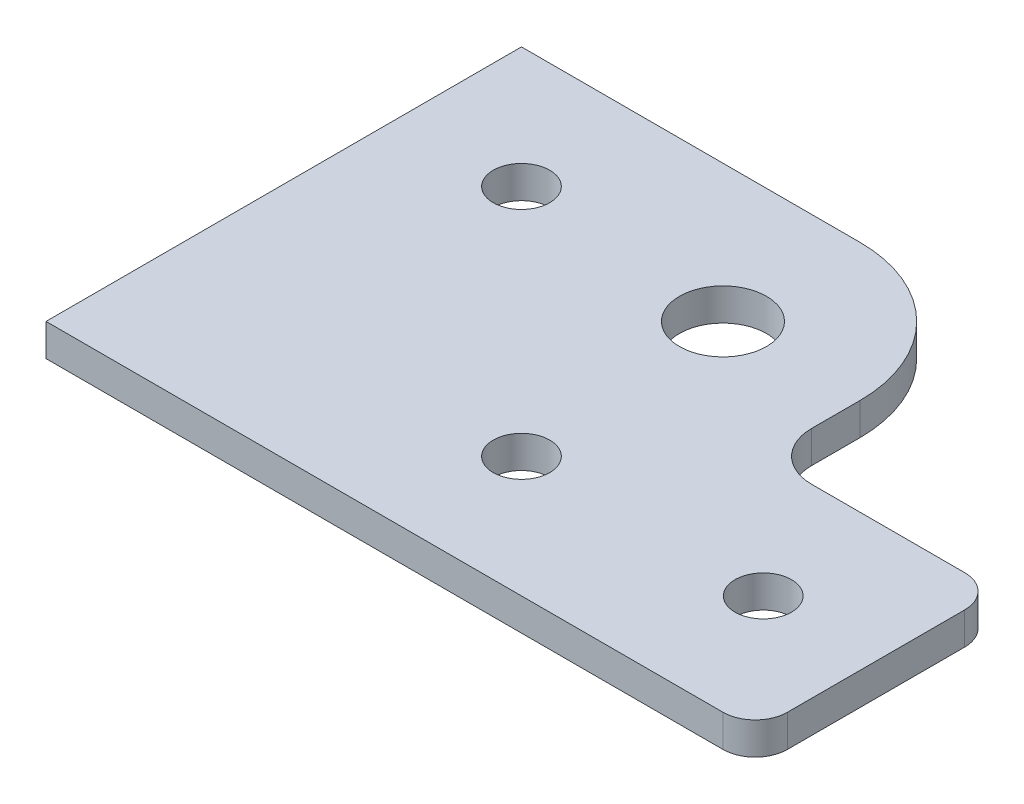
ISO-10303-21;
HEADER;
FILE_DESCRIPTION(('STEP AP214'),'2;1');
FILE_NAME('part.step','',(''),(''),'','','');
FILE_SCHEMA(('AUTOMOTIVE_DESIGN { 1 0 10303 214 1 1 1 1 }'));
ENDSEC;
DATA;
#1=APPLICATION_CONTEXT('core data for automotive mechanical design processes');
#2=APPLICATION_PROTOCOL_DEFINITION('international standard','automotive_design',2000,#1);
#3=PRODUCT_CONTEXT('',#1,'mechanical');
#4=PRODUCT('Part','Part','',(#3));
#5=PRODUCT_RELATED_PRODUCT_CATEGORY('part','',(#4));
#6=PRODUCT_DEFINITION_FORMATION('','',#4);
#7=PRODUCT_DEFINITION_CONTEXT('part definition',#1,'design');
#8=PRODUCT_DEFINITION('design','',#6,#7);
#9=PRODUCT_DEFINITION_SHAPE('','',#8);
#10=(LENGTH_UNIT() NAMED_UNIT(*) SI_UNIT(.MILLI.,.METRE.));
#11=(NAMED_UNIT(*) PLANE_ANGLE_UNIT() SI_UNIT($,.RADIAN.));
#12=(NAMED_UNIT(*) SI_UNIT($,.STERADIAN.) SOLID_ANGLE_UNIT());
#13=UNCERTAINTY_MEASURE_WITH_UNIT(LENGTH_MEASURE(1.E-05),#10,'distance_accuracy_value','');
#14=(GEOMETRIC_REPRESENTATION_CONTEXT(3) GLOBAL_UNCERTAINTY_ASSIGNED_CONTEXT((#13)) GLOBAL_UNIT_ASSIGNED_CONTEXT((#10,
#11,#12)) REPRESENTATION_CONTEXT('',''));
#15=CARTESIAN_POINT('',(0.,0.,0.));
#16=DIRECTION('',(0.,0.,1.));
#17=DIRECTION('',(1.,0.,0.));
#18=AXIS2_PLACEMENT_3D('',#15,#16,#17);
#19=CARTESIAN_POINT('',(21.,2.,-21.));
#20=DIRECTION('',(0.,-1.,0.));
#21=DIRECTION('',(0.,0.,-1.));
#22=AXIS2_PLACEMENT_3D('',#19,#20,#21);
#23=CYLINDRICAL_SURFACE('',#22,8.5);
#24=CARTESIAN_POINT('',(21.,0.,-21.));
#25=DIRECTION('',(0.,1.,0.));
#26=DIRECTION('',(0.,0.,1.));
#27=AXIS2_PLACEMENT_3D('',#24,#25,#26);
#28=CIRCLE('',#27,8.5);
#29=CARTESIAN_POINT('',(29.5,0.,-21.));
#30=VERTEX_POINT('',#29);
#31=CARTESIAN_POINT('',(21.,0.,-29.5));
#32=VERTEX_POINT('',#31);
#33=EDGE_CURVE('E122',#30,#32,#28,.T.);
#34=ORIENTED_EDGE('',*,*,#33,.T.);
#35=DIRECTION('',(0.,-1.,0.));
#36=VECTOR('',#35,1.);
#37=CARTESIAN_POINT('',(21.,2.,-29.5));
#38=LINE('',#37,#36);
#39=CARTESIAN_POINT('',(21.,2.,-29.5));
#40=VERTEX_POINT('',#39);
#41=EDGE_CURVE('E125',#40,#32,#38,.T.);
#42=ORIENTED_EDGE('',*,*,#41,.F.);
#43=CARTESIAN_POINT('',(21.,2.,-21.));
#44=DIRECTION('',(0.,1.,0.));
#45=DIRECTION('',(0.,0.,1.));
#46=AXIS2_PLACEMENT_3D('',#43,#44,#45);
#47=CIRCLE('',#46,8.5);
#48=CARTESIAN_POINT('',(29.5,2.,-21.));
#49=VERTEX_POINT('',#48);
#50=EDGE_CURVE('E164',#49,#40,#47,.T.);
#51=ORIENTED_EDGE('',*,*,#50,.F.);
#52=DIRECTION('',(0.,-1.,0.));
#53=VECTOR('',#52,1.);
#54=CARTESIAN_POINT('',(29.5,2.,-21.));
#55=LINE('',#54,#53);
#56=EDGE_CURVE('E127',#49,#30,#55,.T.);
#57=ORIENTED_EDGE('',*,*,#56,.T.);
#58=EDGE_LOOP('',(#34,#42,#51,#57));
#59=FACE_BOUND('',#58,.T.);
#60=ADVANCED_FACE('F44',(#59),#23,.T.);
#61=CARTESIAN_POINT('',(0.,2.,0.));
#62=DIRECTION('',(1.,0.,0.));
#63=DIRECTION('',(0.,0.,-1.));
#64=AXIS2_PLACEMENT_3D('',#61,#62,#63);
#65=PLANE('',#64);
#66=DIRECTION('',(0.,0.,1.));
#67=VECTOR('',#66,1.);
#68=CARTESIAN_POINT('',(0.,0.,0.));
#69=LINE('',#68,#67);
#70=CARTESIAN_POINT('',(0.,0.,-29.5));
#71=VERTEX_POINT('',#70);
#72=CARTESIAN_POINT('',(0.,0.,0.));
#73=VERTEX_POINT('',#72);
#74=EDGE_CURVE('E131',#71,#73,#69,.T.);
#75=ORIENTED_EDGE('',*,*,#74,.T.);
#76=DIRECTION('',(0.,-1.,0.));
#77=VECTOR('',#76,1.);
#78=CARTESIAN_POINT('',(0.,2.,0.));
#79=LINE('',#78,#77);
#80=CARTESIAN_POINT('',(0.,2.,0.));
#81=VERTEX_POINT('',#80);
#82=EDGE_CURVE('E143',#81,#73,#79,.T.);
#83=ORIENTED_EDGE('',*,*,#82,.F.);
#84=DIRECTION('',(0.,0.,1.));
#85=VECTOR('',#84,1.);
#86=CARTESIAN_POINT('',(0.,2.,0.));
#87=LINE('',#86,#85);
#88=CARTESIAN_POINT('',(0.,2.,-29.5));
#89=VERTEX_POINT('',#88);
#90=EDGE_CURVE('E167',#89,#81,#87,.T.);
#91=ORIENTED_EDGE('',*,*,#90,.F.);
#92=DIRECTION('',(0.,1.,0.));
#93=VECTOR('',#92,1.);
#94=CARTESIAN_POINT('',(0.,0.,-29.5));
#95=LINE('',#94,#93);
#96=EDGE_CURVE('E150',#71,#89,#95,.T.);
#97=ORIENTED_EDGE('',*,*,#96,.F.);
#98=EDGE_LOOP('',(#75,#83,#91,#97));
#99=FACE_BOUND('',#98,.T.);
#100=ADVANCED_FACE('F290',(#99),#65,.F.);
#101=CARTESIAN_POINT('',(0.,2.,0.));
#102=DIRECTION('',(0.,0.,-1.));
#103=DIRECTION('',(-1.,0.,0.));
#104=AXIS2_PLACEMENT_3D('',#101,#102,#103);
#105=PLANE('',#104);
#106=DIRECTION('',(1.,0.,0.));
#107=VECTOR('',#106,1.);
#108=CARTESIAN_POINT('',(0.,0.,0.));
#109=LINE('',#108,#107);
#110=CARTESIAN_POINT('',(42.,0.,0.));
#111=VERTEX_POINT('',#110);
#112=EDGE_CURVE('E204',#73,#111,#109,.T.);
#113=ORIENTED_EDGE('',*,*,#112,.T.);
#114=DIRECTION('',(0.,-1.,0.));
#115=VECTOR('',#114,1.);
#116=CARTESIAN_POINT('',(42.,2.,0.));
#117=LINE('',#116,#115);
#118=CARTESIAN_POINT('',(42.,2.,0.));
#119=VERTEX_POINT('',#118);
#120=EDGE_CURVE('E247',#119,#111,#117,.T.);
#121=ORIENTED_EDGE('',*,*,#120,.F.);
#122=DIRECTION('',(1.,0.,0.));
#123=VECTOR('',#122,1.);
#124=CARTESIAN_POINT('',(0.,2.,0.));
#125=LINE('',#124,#123);
#126=EDGE_CURVE('E171',#81,#119,#125,.T.);
#127=ORIENTED_EDGE('',*,*,#126,.F.);
#128=ORIENTED_EDGE('',*,*,#82,.T.);
#129=EDGE_LOOP('',(#113,#121,#127,#128));
#130=FACE_BOUND('',#129,.T.);
#131=ADVANCED_FACE('F286',(#130),#105,.F.);
#132=CARTESIAN_POINT('',(42.,2.,-2.));
#133=DIRECTION('',(0.,-1.,0.));
#134=DIRECTION('',(0.,0.,-1.));
#135=AXIS2_PLACEMENT_3D('',#132,#133,#134);
#136=CYLINDRICAL_SURFACE('',#135,2.);
#137=CARTESIAN_POINT('',(42.,0.,-2.));
#138=DIRECTION('',(0.,1.,0.));
#139=DIRECTION('',(0.,0.,1.));
#140=AXIS2_PLACEMENT_3D('',#137,#138,#139);
#141=CIRCLE('',#140,2.);
#142=CARTESIAN_POINT('',(44.,0.,-2.00000000000001));
#143=VERTEX_POINT('',#142);
#144=EDGE_CURVE('E207',#111,#143,#141,.T.);
#145=ORIENTED_EDGE('',*,*,#144,.T.);
#146=DIRECTION('',(0.,-1.,0.));
#147=VECTOR('',#146,1.);
#148=CARTESIAN_POINT('',(44.,2.,-2.00000000000001));
#149=LINE('',#148,#147);
#150=CARTESIAN_POINT('',(44.,2.,-2.00000000000001));
#151=VERTEX_POINT('',#150);
#152=EDGE_CURVE('E243',#151,#143,#149,.T.);
#153=ORIENTED_EDGE('',*,*,#152,.F.);
#154=CARTESIAN_POINT('',(42.,2.,-2.));
#155=DIRECTION('',(0.,1.,0.));
#156=DIRECTION('',(0.,0.,1.));
#157=AXIS2_PLACEMENT_3D('',#154,#155,#156);
#158=CIRCLE('',#157,2.);
#159=EDGE_CURVE('E174',#119,#151,#158,.T.);
#160=ORIENTED_EDGE('',*,*,#159,.F.);
#161=ORIENTED_EDGE('',*,*,#120,.T.);
#162=EDGE_LOOP('',(#145,#153,#160,#161));
#163=FACE_BOUND('',#162,.T.);
#164=ADVANCED_FACE('F283',(#163),#136,.T.);
#165=CARTESIAN_POINT('',(44.,2.,0.));
#166=DIRECTION('',(-1.,0.,0.));
#167=DIRECTION('',(0.,0.,1.));
#168=AXIS2_PLACEMENT_3D('',#165,#166,#167);
#169=PLANE('',#168);
#170=DIRECTION('',(0.,0.,-1.));
#171=VECTOR('',#170,1.);
#172=CARTESIAN_POINT('',(44.,0.,0.));
#173=LINE('',#172,#171);
#174=CARTESIAN_POINT('',(44.,0.,-13.));
#175=VERTEX_POINT('',#174);
#176=EDGE_CURVE('E210',#143,#175,#173,.T.);
#177=ORIENTED_EDGE('',*,*,#176,.T.);
#178=DIRECTION('',(0.,-1.,0.));
#179=VECTOR('',#178,1.);
#180=CARTESIAN_POINT('',(44.,2.,-13.));
#181=LINE('',#180,#179);
#182=CARTESIAN_POINT('',(44.,2.,-13.));
#183=VERTEX_POINT('',#182);
#184=EDGE_CURVE('E239',#183,#175,#181,.T.);
#185=ORIENTED_EDGE('',*,*,#184,.F.);
#186=DIRECTION('',(0.,0.,-1.));
#187=VECTOR('',#186,1.);
#188=CARTESIAN_POINT('',(44.,2.,0.));
#189=LINE('',#188,#187);
#190=EDGE_CURVE('E177',#151,#183,#189,.T.);
#191=ORIENTED_EDGE('',*,*,#190,.F.);
#192=ORIENTED_EDGE('',*,*,#152,.T.);
#193=EDGE_LOOP('',(#177,#185,#191,#192));
#194=FACE_BOUND('',#193,.T.);
#195=ADVANCED_FACE('F279',(#194),#169,.F.);
#196=CARTESIAN_POINT('',(42.,2.,-13.));
#197=DIRECTION('',(0.,-1.,0.));
#198=DIRECTION('',(0.,0.,-1.));
#199=AXIS2_PLACEMENT_3D('',#196,#197,#198);
#200=CYLINDRICAL_SURFACE('',#199,2.);
#201=CARTESIAN_POINT('',(42.,0.,-13.));
#202=DIRECTION('',(0.,1.,0.));
#203=DIRECTION('',(0.,0.,1.));
#204=AXIS2_PLACEMENT_3D('',#201,#202,#203);
#205=CIRCLE('',#204,2.);
#206=CARTESIAN_POINT('',(42.,0.,-15.));
#207=VERTEX_POINT('',#206);
#208=EDGE_CURVE('E213',#175,#207,#205,.T.);
#209=ORIENTED_EDGE('',*,*,#208,.T.);
#210=DIRECTION('',(0.,-1.,0.));
#211=VECTOR('',#210,1.);
#212=CARTESIAN_POINT('',(42.,2.,-15.));
#213=LINE('',#212,#211);
#214=CARTESIAN_POINT('',(42.,2.,-15.));
#215=VERTEX_POINT('',#214);
#216=EDGE_CURVE('E235',#215,#207,#213,.T.);
#217=ORIENTED_EDGE('',*,*,#216,.F.);
#218=CARTESIAN_POINT('',(42.,2.,-13.));
#219=DIRECTION('',(0.,1.,0.));
#220=DIRECTION('',(0.,0.,1.));
#221=AXIS2_PLACEMENT_3D('',#218,#219,#220);
#222=CIRCLE('',#221,2.);
#223=EDGE_CURVE('E180',#183,#215,#222,.T.);
#224=ORIENTED_EDGE('',*,*,#223,.F.);
#225=ORIENTED_EDGE('',*,*,#184,.T.);
#226=EDGE_LOOP('',(#209,#217,#224,#225));
#227=FACE_BOUND('',#226,.T.);
#228=ADVANCED_FACE('F275',(#227),#200,.T.);
#229=CARTESIAN_POINT('',(0.,2.,-15.));
#230=DIRECTION('',(0.,0.,1.));
#231=DIRECTION('',(1.,0.,0.));
#232=AXIS2_PLACEMENT_3D('',#229,#230,#231);
#233=PLANE('',#232);
#234=DIRECTION('',(-1.,0.,0.));
#235=VECTOR('',#234,1.);
#236=CARTESIAN_POINT('',(0.,0.,-15.));
#237=LINE('',#236,#235);
#238=CARTESIAN_POINT('',(32.5,0.,-15.));
#239=VERTEX_POINT('',#238);
#240=EDGE_CURVE('E216',#207,#239,#237,.T.);
#241=ORIENTED_EDGE('',*,*,#240,.T.);
#242=DIRECTION('',(0.,-1.,0.));
#243=VECTOR('',#242,1.);
#244=CARTESIAN_POINT('',(32.5,2.,-15.));
#245=LINE('',#244,#243);
#246=CARTESIAN_POINT('',(32.5,2.,-15.));
#247=VERTEX_POINT('',#246);
#248=EDGE_CURVE('E60',#239,#247,#245,.F.);
#249=ORIENTED_EDGE('',*,*,#248,.T.);
#250=DIRECTION('',(-1.,0.,0.));
#251=VECTOR('',#250,1.);
#252=CARTESIAN_POINT('',(0.,2.,-15.));
#253=LINE('',#252,#251);
#254=EDGE_CURVE('E183',#215,#247,#253,.T.);
#255=ORIENTED_EDGE('',*,*,#254,.F.);
#256=ORIENTED_EDGE('',*,*,#216,.T.);
#257=EDGE_LOOP('',(#241,#249,#255,#256));
#258=FACE_BOUND('',#257,.T.);
#259=ADVANCED_FACE('F270',(#258),#233,.F.);
#260=CARTESIAN_POINT('',(7.5,2.,-22.));
#261=DIRECTION('',(0.,-1.,0.));
#262=DIRECTION('',(0.,0.,-1.));
#263=AXIS2_PLACEMENT_3D('',#260,#261,#262);
#264=CYLINDRICAL_SURFACE('',#263,1.75);
#265=CARTESIAN_POINT('',(7.5,2.,-22.));
#266=DIRECTION('',(0.,1.,0.));
#267=DIRECTION('',(0.,0.,1.));
#268=AXIS2_PLACEMENT_3D('',#265,#266,#267);
#269=CIRCLE('',#268,1.75);
#270=CARTESIAN_POINT('',(7.5,2.,-20.25));
#271=VERTEX_POINT('',#270);
#272=EDGE_CURVE('E198',#271,#271,#269,.T.);
#273=ORIENTED_EDGE('',*,*,#272,.T.);
#274=EDGE_LOOP('',(#273));
#275=FACE_BOUND('',#274,.T.);
#276=CARTESIAN_POINT('',(7.5,0.,-22.));
#277=DIRECTION('',(0.,1.,0.));
#278=DIRECTION('',(0.,0.,1.));
#279=AXIS2_PLACEMENT_3D('',#276,#277,#278);
#280=CIRCLE('',#279,1.75);
#281=CARTESIAN_POINT('',(7.5,0.,-20.25));
#282=VERTEX_POINT('',#281);
#283=EDGE_CURVE('E168',#282,#282,#280,.T.);
#284=ORIENTED_EDGE('',*,*,#283,.F.);
#285=EDGE_LOOP('',(#284));
#286=FACE_BOUND('',#285,.T.);
#287=ADVANCED_FACE('F307',(#275,#286),#264,.F.);
#288=CARTESIAN_POINT('',(22.,2.,-7.5));
#289=DIRECTION('',(0.,-1.,0.));
#290=DIRECTION('',(0.,0.,-1.));
#291=AXIS2_PLACEMENT_3D('',#288,#289,#290);
#292=CYLINDRICAL_SURFACE('',#291,1.75);
#293=CARTESIAN_POINT('',(22.,2.,-7.5));
#294=DIRECTION('',(0.,1.,0.));
#295=DIRECTION('',(0.,0.,1.));
#296=AXIS2_PLACEMENT_3D('',#293,#294,#295);
#297=CIRCLE('',#296,1.75);
#298=CARTESIAN_POINT('',(22.,2.,-5.75));
#299=VERTEX_POINT('',#298);
#300=EDGE_CURVE('E194',#299,#299,#297,.T.);
#301=ORIENTED_EDGE('',*,*,#300,.T.);
#302=EDGE_LOOP('',(#301));
#303=FACE_BOUND('',#302,.T.);
#304=CARTESIAN_POINT('',(22.,0.,-7.5));
#305=DIRECTION('',(0.,1.,0.));
#306=DIRECTION('',(0.,0.,1.));
#307=AXIS2_PLACEMENT_3D('',#304,#305,#306);
#308=CIRCLE('',#307,1.75);
#309=CARTESIAN_POINT('',(22.,0.,-5.75));
#310=VERTEX_POINT('',#309);
#311=EDGE_CURVE('E226',#310,#310,#308,.T.);
#312=ORIENTED_EDGE('',*,*,#311,.F.);
#313=EDGE_LOOP('',(#312));
#314=FACE_BOUND('',#313,.T.);
#315=ADVANCED_FACE('F313',(#303,#314),#292,.F.);
#316=CARTESIAN_POINT('',(37.,2.,-7.5));
#317=DIRECTION('',(0.,-1.,0.));
#318=DIRECTION('',(0.,0.,-1.));
#319=AXIS2_PLACEMENT_3D('',#316,#317,#318);
#320=CYLINDRICAL_SURFACE('',#319,1.75);
#321=CARTESIAN_POINT('',(37.,2.,-7.5));
#322=DIRECTION('',(0.,1.,0.));
#323=DIRECTION('',(0.,0.,1.));
#324=AXIS2_PLACEMENT_3D('',#321,#322,#323);
#325=CIRCLE('',#324,1.75);
#326=CARTESIAN_POINT('',(37.,2.,-5.75));
#327=VERTEX_POINT('',#326);
#328=EDGE_CURVE('E190',#327,#327,#325,.T.);
#329=ORIENTED_EDGE('',*,*,#328,.T.);
#330=EDGE_LOOP('',(#329));
#331=FACE_BOUND('',#330,.T.);
#332=CARTESIAN_POINT('',(37.,0.,-7.5));
#333=DIRECTION('',(0.,1.,0.));
#334=DIRECTION('',(0.,0.,1.));
#335=AXIS2_PLACEMENT_3D('',#332,#333,#334);
#336=CIRCLE('',#335,1.75);
#337=CARTESIAN_POINT('',(37.,0.,-5.75));
#338=VERTEX_POINT('',#337);
#339=EDGE_CURVE('E222',#338,#338,#336,.T.);
#340=ORIENTED_EDGE('',*,*,#339,.F.);
#341=EDGE_LOOP('',(#340));
#342=FACE_BOUND('',#341,.T.);
#343=ADVANCED_FACE('F310',(#331,#342),#320,.F.);
#344=CARTESIAN_POINT('',(29.5,2.,0.));
#345=DIRECTION('',(1.,0.,0.));
#346=DIRECTION('',(0.,0.,-1.));
#347=AXIS2_PLACEMENT_3D('',#344,#345,#346);
#348=PLANE('',#347);
#349=DIRECTION('',(0.,0.,1.));
#350=VECTOR('',#349,1.);
#351=CARTESIAN_POINT('',(29.5,2.,0.));
#352=LINE('',#351,#350);
#353=CARTESIAN_POINT('',(29.5,2.,-18.));
#354=VERTEX_POINT('',#353);
#355=EDGE_CURVE('E186',#49,#354,#352,.T.);
#356=ORIENTED_EDGE('',*,*,#355,.T.);
#357=DIRECTION('',(0.,-1.,0.));
#358=VECTOR('',#357,1.);
#359=CARTESIAN_POINT('',(29.5,2.,-18.));
#360=LINE('',#359,#358);
#361=CARTESIAN_POINT('',(29.5,0.,-18.));
#362=VERTEX_POINT('',#361);
#363=EDGE_CURVE('E142',#354,#362,#360,.T.);
#364=ORIENTED_EDGE('',*,*,#363,.T.);
#365=DIRECTION('',(0.,0.,1.));
#366=VECTOR('',#365,1.);
#367=CARTESIAN_POINT('',(29.5,0.,0.));
#368=LINE('',#367,#366);
#369=EDGE_CURVE('E219',#30,#362,#368,.T.);
#370=ORIENTED_EDGE('',*,*,#369,.F.);
#371=ORIENTED_EDGE('',*,*,#56,.F.);
#372=EDGE_LOOP('',(#356,#364,#370,#371));
#373=FACE_BOUND('',#372,.T.);
#374=ADVANCED_FACE('F261',(#373),#348,.T.);
#375=CARTESIAN_POINT('',(0.,2.,0.));
#376=DIRECTION('',(0.,1.,0.));
#377=DIRECTION('',(0.,0.,1.));
#378=AXIS2_PLACEMENT_3D('',#375,#376,#377);
#379=PLANE('',#378);
#380=ORIENTED_EDGE('',*,*,#50,.T.);
#381=DIRECTION('',(-1.,0.,0.));
#382=VECTOR('',#381,1.);
#383=CARTESIAN_POINT('',(21.,2.,-29.5));
#384=LINE('',#383,#382);
#385=EDGE_CURVE('E140',#40,#89,#384,.T.);
#386=ORIENTED_EDGE('',*,*,#385,.T.);
#387=ORIENTED_EDGE('',*,*,#90,.T.);
#388=ORIENTED_EDGE('',*,*,#126,.T.);
#389=ORIENTED_EDGE('',*,*,#159,.T.);
#390=ORIENTED_EDGE('',*,*,#190,.T.);
#391=ORIENTED_EDGE('',*,*,#223,.T.);
#392=ORIENTED_EDGE('',*,*,#254,.T.);
#393=CARTESIAN_POINT('',(32.5,2.,-18.));
#394=DIRECTION('',(0.,1.,0.));
#395=DIRECTION('',(0.,0.,1.));
#396=AXIS2_PLACEMENT_3D('',#393,#394,#395);
#397=CIRCLE('',#396,3.);
#398=EDGE_CURVE('E11',#247,#354,#397,.F.);
#399=ORIENTED_EDGE('',*,*,#398,.T.);
#400=ORIENTED_EDGE('',*,*,#355,.F.);
#401=EDGE_LOOP('',(#380,#386,#387,#388,#389,#390,#391,#392,#399,#400));
#402=FACE_BOUND('',#401,.T.);
#403=ORIENTED_EDGE('',*,*,#328,.F.);
#404=EDGE_LOOP('',(#403));
#405=FACE_BOUND('',#404,.T.);
#406=ORIENTED_EDGE('',*,*,#300,.F.);
#407=EDGE_LOOP('',(#406));
#408=FACE_BOUND('',#407,.T.);
#409=ORIENTED_EDGE('',*,*,#272,.F.);
#410=EDGE_LOOP('',(#409));
#411=FACE_BOUND('',#410,.T.);
#412=CARTESIAN_POINT('',(21.,2.,-21.));
#413=DIRECTION('',(0.,1.,0.));
#414=DIRECTION('',(0.,0.,1.));
#415=AXIS2_PLACEMENT_3D('',#412,#413,#414);
#416=CIRCLE('',#415,2.7);
#417=CARTESIAN_POINT('',(21.,2.,-18.3));
#418=VERTEX_POINT('',#417);
#419=EDGE_CURVE('E154',#418,#418,#416,.T.);
#420=ORIENTED_EDGE('',*,*,#419,.F.);
#421=EDGE_LOOP('',(#420));
#422=FACE_BOUND('',#421,.T.);
#423=ADVANCED_FACE('F266',(#402,#405,#408,#411,#422),#379,.T.);
#424=CARTESIAN_POINT('',(0.,0.,0.));
#425=DIRECTION('',(0.,1.,0.));
#426=DIRECTION('',(0.,0.,1.));
#427=AXIS2_PLACEMENT_3D('',#424,#425,#426);
#428=PLANE('',#427);
#429=ORIENTED_EDGE('',*,*,#33,.F.);
#430=ORIENTED_EDGE('',*,*,#369,.T.);
#431=CARTESIAN_POINT('',(32.5,0.,-18.));
#432=DIRECTION('',(0.,1.,0.));
#433=DIRECTION('',(0.,0.,1.));
#434=AXIS2_PLACEMENT_3D('',#431,#432,#433);
#435=CIRCLE('',#434,3.);
#436=EDGE_CURVE('E53',#362,#239,#435,.T.);
#437=ORIENTED_EDGE('',*,*,#436,.T.);
#438=ORIENTED_EDGE('',*,*,#240,.F.);
#439=ORIENTED_EDGE('',*,*,#208,.F.);
#440=ORIENTED_EDGE('',*,*,#176,.F.);
#441=ORIENTED_EDGE('',*,*,#144,.F.);
#442=ORIENTED_EDGE('',*,*,#112,.F.);
#443=ORIENTED_EDGE('',*,*,#74,.F.);
#444=DIRECTION('',(-1.,0.,0.));
#445=VECTOR('',#444,1.);
#446=CARTESIAN_POINT('',(21.,0.,-29.5));
#447=LINE('',#446,#445);
#448=EDGE_CURVE('E138',#32,#71,#447,.T.);
#449=ORIENTED_EDGE('',*,*,#448,.F.);
#450=EDGE_LOOP('',(#429,#430,#437,#438,#439,#440,#441,#442,#443,#449));
#451=FACE_BOUND('',#450,.T.);
#452=ORIENTED_EDGE('',*,*,#339,.T.);
#453=EDGE_LOOP('',(#452));
#454=FACE_BOUND('',#453,.T.);
#455=ORIENTED_EDGE('',*,*,#311,.T.);
#456=EDGE_LOOP('',(#455));
#457=FACE_BOUND('',#456,.T.);
#458=ORIENTED_EDGE('',*,*,#283,.T.);
#459=EDGE_LOOP('',(#458));
#460=FACE_BOUND('',#459,.T.);
#461=CARTESIAN_POINT('',(21.,0.,-21.));
#462=DIRECTION('',(0.,1.,0.));
#463=DIRECTION('',(0.,0.,1.));
#464=AXIS2_PLACEMENT_3D('',#461,#462,#463);
#465=CIRCLE('',#464,2.7);
#466=CARTESIAN_POINT('',(21.,0.,-18.3));
#467=VERTEX_POINT('',#466);
#468=EDGE_CURVE('E132',#467,#467,#465,.T.);
#469=ORIENTED_EDGE('',*,*,#468,.T.);
#470=EDGE_LOOP('',(#469));
#471=FACE_BOUND('',#470,.T.);
#472=ADVANCED_FACE('F145',(#451,#454,#457,#460,#471),#428,.F.);
#473=CARTESIAN_POINT('',(32.5,2.,-18.));
#474=DIRECTION('',(0.,-1.,0.));
#475=DIRECTION('',(0.,0.,-1.));
#476=AXIS2_PLACEMENT_3D('',#473,#474,#475);
#477=CYLINDRICAL_SURFACE('',#476,3.);
#478=ORIENTED_EDGE('',*,*,#398,.F.);
#479=ORIENTED_EDGE('',*,*,#248,.F.);
#480=ORIENTED_EDGE('',*,*,#436,.F.);
#481=ORIENTED_EDGE('',*,*,#363,.F.);
#482=EDGE_LOOP('',(#478,#479,#480,#481));
#483=FACE_BOUND('',#482,.T.);
#484=ADVANCED_FACE('F46',(#483),#477,.F.);
#485=CARTESIAN_POINT('',(21.,0.,-21.));
#486=DIRECTION('',(0.,1.,0.));
#487=DIRECTION('',(0.,0.,1.));
#488=AXIS2_PLACEMENT_3D('',#485,#486,#487);
#489=CYLINDRICAL_SURFACE('',#488,2.7);
#490=ORIENTED_EDGE('',*,*,#468,.F.);
#491=EDGE_LOOP('',(#490));
#492=FACE_BOUND('',#491,.T.);
#493=ORIENTED_EDGE('',*,*,#419,.T.);
#494=EDGE_LOOP('',(#493));
#495=FACE_BOUND('',#494,.T.);
#496=ADVANCED_FACE('F325',(#492,#495),#489,.F.);
#497=CARTESIAN_POINT('',(21.,0.,-29.5));
#498=DIRECTION('',(0.,0.,-1.));
#499=DIRECTION('',(-1.,0.,0.));
#500=AXIS2_PLACEMENT_3D('',#497,#498,#499);
#501=PLANE('',#500);
#502=ORIENTED_EDGE('',*,*,#385,.F.);
#503=ORIENTED_EDGE('',*,*,#41,.T.);
#504=ORIENTED_EDGE('',*,*,#448,.T.);
#505=ORIENTED_EDGE('',*,*,#96,.T.);
#506=EDGE_LOOP('',(#502,#503,#504,#505));
#507=FACE_BOUND('',#506,.T.);
#508=ADVANCED_FACE('F136',(#507),#501,.T.);
#509=CLOSED_SHELL('',(#60,#100,#131,#164,#195,#228,#259,#287,#315,#343,#374,#423,#472,#484,#496,#508));
#510=MANIFOLD_SOLID_BREP('B2',#509);
#511=ADVANCED_BREP_SHAPE_REPRESENTATION('',(#18,#510),#14);
#512=SHAPE_DEFINITION_REPRESENTATION(#9,#511);
ENDSEC;
END-ISO-10303-21;
